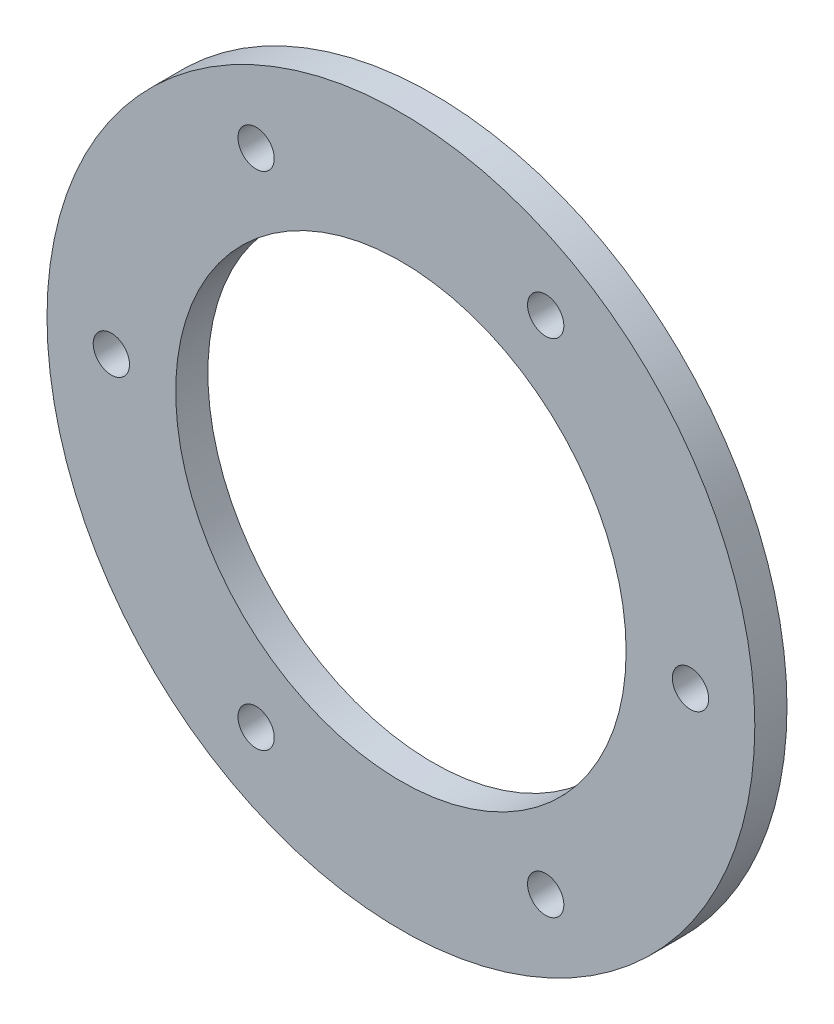
ISO-10303-21;
HEADER;
FILE_DESCRIPTION(('STEP AP214'),'2;1');
FILE_NAME('part.step','',(''),(''),'','','');
FILE_SCHEMA(('AUTOMOTIVE_DESIGN { 1 0 10303 214 1 1 1 1 }'));
ENDSEC;
DATA;
#1=APPLICATION_CONTEXT('core data for automotive mechanical design processes');
#2=APPLICATION_PROTOCOL_DEFINITION('international standard','automotive_design',2000,#1);
#3=PRODUCT_CONTEXT('',#1,'mechanical');
#4=PRODUCT('Part','Part','',(#3));
#5=PRODUCT_RELATED_PRODUCT_CATEGORY('part','',(#4));
#6=PRODUCT_DEFINITION_FORMATION('','',#4);
#7=PRODUCT_DEFINITION_CONTEXT('part definition',#1,'design');
#8=PRODUCT_DEFINITION('design','',#6,#7);
#9=PRODUCT_DEFINITION_SHAPE('','',#8);
#10=(LENGTH_UNIT() NAMED_UNIT(*) SI_UNIT(.MILLI.,.METRE.));
#11=(NAMED_UNIT(*) PLANE_ANGLE_UNIT() SI_UNIT($,.RADIAN.));
#12=(NAMED_UNIT(*) SI_UNIT($,.STERADIAN.) SOLID_ANGLE_UNIT());
#13=UNCERTAINTY_MEASURE_WITH_UNIT(LENGTH_MEASURE(1.E-05),#10,'distance_accuracy_value','');
#14=(GEOMETRIC_REPRESENTATION_CONTEXT(3) GLOBAL_UNCERTAINTY_ASSIGNED_CONTEXT((#13)) GLOBAL_UNIT_ASSIGNED_CONTEXT((#10,
#11,#12)) REPRESENTATION_CONTEXT('',''));
#15=CARTESIAN_POINT('',(0.,0.,0.));
#16=DIRECTION('',(0.,0.,1.));
#17=DIRECTION('',(1.,0.,0.));
#18=AXIS2_PLACEMENT_3D('',#15,#16,#17);
#19=CARTESIAN_POINT('',(365.374066295216,488.872837660157,3.175));
#20=DIRECTION('',(0.,0.,1.));
#21=DIRECTION('',(1.,0.,0.));
#22=AXIS2_PLACEMENT_3D('',#19,#20,#21);
#23=PLANE('',#22);
#24=CARTESIAN_POINT('',(365.374066295216,488.872837660157,3.175));
#25=DIRECTION('',(0.,0.,1.));
#26=DIRECTION('',(1.,0.,0.));
#27=AXIS2_PLACEMENT_3D('',#24,#25,#26);
#28=CIRCLE('',#27,22.225);
#29=CARTESIAN_POINT('',(387.599066295216,488.872837660157,3.175));
#30=VERTEX_POINT('',#29);
#31=EDGE_CURVE('E47',#30,#30,#28,.F.);
#32=ORIENTED_EDGE('',*,*,#31,.T.);
#33=EDGE_LOOP('',(#32));
#34=FACE_BOUND('',#33,.T.);
#35=CARTESIAN_POINT('',(336.799066295216,488.872837660157,3.17500000000001));
#36=DIRECTION('',(0.,0.,-1.));
#37=DIRECTION('',(-1.,0.,0.));
#38=AXIS2_PLACEMENT_3D('',#35,#36,#37);
#39=CIRCLE('',#38,1.7907);
#40=CARTESIAN_POINT('',(335.008366295216,488.872837660157,3.17500000000001));
#41=VERTEX_POINT('',#40);
#42=EDGE_CURVE('E50',#41,#41,#39,.T.);
#43=ORIENTED_EDGE('',*,*,#42,.T.);
#44=EDGE_LOOP('',(#43));
#45=FACE_BOUND('',#44,.T.);
#46=CARTESIAN_POINT('',(351.086566295216,464.126161747017,3.17500000000001));
#47=DIRECTION('',(0.,0.,-1.));
#48=DIRECTION('',(-1.,0.,0.));
#49=AXIS2_PLACEMENT_3D('',#46,#47,#48);
#50=CIRCLE('',#49,1.7907);
#51=CARTESIAN_POINT('',(349.295866295216,464.126161747017,3.17500000000001));
#52=VERTEX_POINT('',#51);
#53=EDGE_CURVE('E53',#52,#52,#50,.T.);
#54=ORIENTED_EDGE('',*,*,#53,.T.);
#55=EDGE_LOOP('',(#54));
#56=FACE_BOUND('',#55,.T.);
#57=CARTESIAN_POINT('',(379.661566295216,464.126161747017,3.17500000000001));
#58=DIRECTION('',(0.,0.,-1.));
#59=DIRECTION('',(-1.,0.,0.));
#60=AXIS2_PLACEMENT_3D('',#57,#58,#59);
#61=CIRCLE('',#60,1.7907);
#62=CARTESIAN_POINT('',(377.870866295216,464.126161747017,3.17500000000001));
#63=VERTEX_POINT('',#62);
#64=EDGE_CURVE('E56',#63,#63,#61,.T.);
#65=ORIENTED_EDGE('',*,*,#64,.T.);
#66=EDGE_LOOP('',(#65));
#67=FACE_BOUND('',#66,.T.);
#68=CARTESIAN_POINT('',(393.949066295216,488.872837660157,3.17500000000001));
#69=DIRECTION('',(0.,0.,-1.));
#70=DIRECTION('',(-1.,0.,0.));
#71=AXIS2_PLACEMENT_3D('',#68,#69,#70);
#72=CIRCLE('',#71,1.7907);
#73=CARTESIAN_POINT('',(392.158366295216,488.872837660157,3.17500000000001));
#74=VERTEX_POINT('',#73);
#75=EDGE_CURVE('E59',#74,#74,#72,.T.);
#76=ORIENTED_EDGE('',*,*,#75,.T.);
#77=EDGE_LOOP('',(#76));
#78=FACE_BOUND('',#77,.T.);
#79=CARTESIAN_POINT('',(379.661566295216,513.619513573297,3.17500000000001));
#80=DIRECTION('',(0.,0.,-1.));
#81=DIRECTION('',(-1.,0.,0.));
#82=AXIS2_PLACEMENT_3D('',#79,#80,#81);
#83=CIRCLE('',#82,1.7907);
#84=CARTESIAN_POINT('',(377.870866295216,513.619513573297,3.17500000000001));
#85=VERTEX_POINT('',#84);
#86=EDGE_CURVE('E62',#85,#85,#83,.T.);
#87=ORIENTED_EDGE('',*,*,#86,.T.);
#88=EDGE_LOOP('',(#87));
#89=FACE_BOUND('',#88,.T.);
#90=CARTESIAN_POINT('',(351.086566295216,513.619513573297,3.17500000000001));
#91=DIRECTION('',(0.,0.,-1.));
#92=DIRECTION('',(-1.,0.,0.));
#93=AXIS2_PLACEMENT_3D('',#90,#91,#92);
#94=CIRCLE('',#93,1.7907);
#95=CARTESIAN_POINT('',(349.295866295216,513.619513573297,3.17500000000001));
#96=VERTEX_POINT('',#95);
#97=EDGE_CURVE('E64',#96,#96,#94,.T.);
#98=ORIENTED_EDGE('',*,*,#97,.T.);
#99=EDGE_LOOP('',(#98));
#100=FACE_BOUND('',#99,.T.);
#101=CARTESIAN_POINT('',(365.374066295216,488.872837660157,3.175));
#102=DIRECTION('',(0.,0.,1.));
#103=DIRECTION('',(1.,0.,0.));
#104=AXIS2_PLACEMENT_3D('',#101,#102,#103);
#105=CIRCLE('',#104,34.925);
#106=CARTESIAN_POINT('',(400.299066295216,488.872837660157,3.175));
#107=VERTEX_POINT('',#106);
#108=EDGE_CURVE('E18',#107,#107,#105,.F.);
#109=ORIENTED_EDGE('',*,*,#108,.F.);
#110=EDGE_LOOP('',(#109));
#111=FACE_BOUND('',#110,.T.);
#112=ADVANCED_FACE('F15',(#34,#45,#56,#67,#78,#89,#100,#111),#23,.T.);
#113=CARTESIAN_POINT('',(365.374066295216,488.872837660157,0.));
#114=DIRECTION('',(0.,0.,1.));
#115=DIRECTION('',(1.,0.,0.));
#116=AXIS2_PLACEMENT_3D('',#113,#114,#115);
#117=CYLINDRICAL_SURFACE('',#116,34.925);
#118=CARTESIAN_POINT('',(365.374066295216,488.872837660157,0.));
#119=DIRECTION('',(0.,0.,1.));
#120=DIRECTION('',(1.,0.,0.));
#121=AXIS2_PLACEMENT_3D('',#118,#119,#120);
#122=CIRCLE('',#121,34.925);
#123=CARTESIAN_POINT('',(400.299066295216,488.872837660157,0.));
#124=VERTEX_POINT('',#123);
#125=EDGE_CURVE('E44',#124,#124,#122,.T.);
#126=ORIENTED_EDGE('',*,*,#125,.T.);
#127=EDGE_LOOP('',(#126));
#128=FACE_BOUND('',#127,.T.);
#129=ORIENTED_EDGE('',*,*,#108,.T.);
#130=EDGE_LOOP('',(#129));
#131=FACE_BOUND('',#130,.T.);
#132=ADVANCED_FACE('F71',(#128,#131),#117,.T.);
#133=CARTESIAN_POINT('',(351.086566295216,513.619513573297,-95.658828343336));
#134=DIRECTION('',(0.,0.,-1.));
#135=DIRECTION('',(-1.,0.,0.));
#136=AXIS2_PLACEMENT_3D('',#133,#134,#135);
#137=CYLINDRICAL_SURFACE('',#136,1.7907);
#138=CARTESIAN_POINT('',(351.086566295216,513.619513573297,0.));
#139=DIRECTION('',(0.,0.,-1.));
#140=DIRECTION('',(-1.,0.,0.));
#141=AXIS2_PLACEMENT_3D('',#138,#139,#140);
#142=CIRCLE('',#141,1.7907);
#143=CARTESIAN_POINT('',(349.295866295216,513.619513573297,0.));
#144=VERTEX_POINT('',#143);
#145=EDGE_CURVE('E41',#144,#144,#142,.T.);
#146=ORIENTED_EDGE('',*,*,#145,.T.);
#147=EDGE_LOOP('',(#146));
#148=FACE_BOUND('',#147,.T.);
#149=ORIENTED_EDGE('',*,*,#97,.F.);
#150=EDGE_LOOP('',(#149));
#151=FACE_BOUND('',#150,.T.);
#152=ADVANCED_FACE('F79',(#148,#151),#137,.F.);
#153=CARTESIAN_POINT('',(379.661566295216,513.619513573297,-95.658828343336));
#154=DIRECTION('',(0.,0.,-1.));
#155=DIRECTION('',(-1.,0.,0.));
#156=AXIS2_PLACEMENT_3D('',#153,#154,#155);
#157=CYLINDRICAL_SURFACE('',#156,1.7907);
#158=CARTESIAN_POINT('',(379.661566295216,513.619513573297,0.));
#159=DIRECTION('',(0.,0.,-1.));
#160=DIRECTION('',(-1.,0.,0.));
#161=AXIS2_PLACEMENT_3D('',#158,#159,#160);
#162=CIRCLE('',#161,1.7907);
#163=CARTESIAN_POINT('',(377.870866295216,513.619513573297,0.));
#164=VERTEX_POINT('',#163);
#165=EDGE_CURVE('E38',#164,#164,#162,.T.);
#166=ORIENTED_EDGE('',*,*,#165,.T.);
#167=EDGE_LOOP('',(#166));
#168=FACE_BOUND('',#167,.T.);
#169=ORIENTED_EDGE('',*,*,#86,.F.);
#170=EDGE_LOOP('',(#169));
#171=FACE_BOUND('',#170,.T.);
#172=ADVANCED_FACE('F108',(#168,#171),#157,.F.);
#173=CARTESIAN_POINT('',(393.949066295216,488.872837660157,-95.658828343336));
#174=DIRECTION('',(0.,0.,-1.));
#175=DIRECTION('',(-1.,0.,0.));
#176=AXIS2_PLACEMENT_3D('',#173,#174,#175);
#177=CYLINDRICAL_SURFACE('',#176,1.7907);
#178=CARTESIAN_POINT('',(393.949066295216,488.872837660157,0.));
#179=DIRECTION('',(0.,0.,-1.));
#180=DIRECTION('',(-1.,0.,0.));
#181=AXIS2_PLACEMENT_3D('',#178,#179,#180);
#182=CIRCLE('',#181,1.7907);
#183=CARTESIAN_POINT('',(392.158366295216,488.872837660157,0.));
#184=VERTEX_POINT('',#183);
#185=EDGE_CURVE('E35',#184,#184,#182,.T.);
#186=ORIENTED_EDGE('',*,*,#185,.T.);
#187=EDGE_LOOP('',(#186));
#188=FACE_BOUND('',#187,.T.);
#189=ORIENTED_EDGE('',*,*,#75,.F.);
#190=EDGE_LOOP('',(#189));
#191=FACE_BOUND('',#190,.T.);
#192=ADVANCED_FACE('F104',(#188,#191),#177,.F.);
#193=CARTESIAN_POINT('',(379.661566295216,464.126161747017,-95.658828343336));
#194=DIRECTION('',(0.,0.,-1.));
#195=DIRECTION('',(-1.,0.,0.));
#196=AXIS2_PLACEMENT_3D('',#193,#194,#195);
#197=CYLINDRICAL_SURFACE('',#196,1.7907);
#198=CARTESIAN_POINT('',(379.661566295216,464.126161747017,0.));
#199=DIRECTION('',(0.,0.,-1.));
#200=DIRECTION('',(-1.,0.,0.));
#201=AXIS2_PLACEMENT_3D('',#198,#199,#200);
#202=CIRCLE('',#201,1.7907);
#203=CARTESIAN_POINT('',(377.870866295216,464.126161747017,0.));
#204=VERTEX_POINT('',#203);
#205=EDGE_CURVE('E32',#204,#204,#202,.T.);
#206=ORIENTED_EDGE('',*,*,#205,.T.);
#207=EDGE_LOOP('',(#206));
#208=FACE_BOUND('',#207,.T.);
#209=ORIENTED_EDGE('',*,*,#64,.F.);
#210=EDGE_LOOP('',(#209));
#211=FACE_BOUND('',#210,.T.);
#212=ADVANCED_FACE('F100',(#208,#211),#197,.F.);
#213=CARTESIAN_POINT('',(351.086566295216,464.126161747017,-95.658828343336));
#214=DIRECTION('',(0.,0.,-1.));
#215=DIRECTION('',(-1.,0.,0.));
#216=AXIS2_PLACEMENT_3D('',#213,#214,#215);
#217=CYLINDRICAL_SURFACE('',#216,1.7907);
#218=CARTESIAN_POINT('',(351.086566295216,464.126161747017,0.));
#219=DIRECTION('',(0.,0.,-1.));
#220=DIRECTION('',(-1.,0.,0.));
#221=AXIS2_PLACEMENT_3D('',#218,#219,#220);
#222=CIRCLE('',#221,1.7907);
#223=CARTESIAN_POINT('',(349.295866295216,464.126161747017,0.));
#224=VERTEX_POINT('',#223);
#225=EDGE_CURVE('E27',#224,#224,#222,.T.);
#226=ORIENTED_EDGE('',*,*,#225,.T.);
#227=EDGE_LOOP('',(#226));
#228=FACE_BOUND('',#227,.T.);
#229=ORIENTED_EDGE('',*,*,#53,.F.);
#230=EDGE_LOOP('',(#229));
#231=FACE_BOUND('',#230,.T.);
#232=ADVANCED_FACE('F96',(#228,#231),#217,.F.);
#233=CARTESIAN_POINT('',(336.799066295216,488.872837660157,-95.658828343336));
#234=DIRECTION('',(0.,0.,-1.));
#235=DIRECTION('',(-1.,0.,0.));
#236=AXIS2_PLACEMENT_3D('',#233,#234,#235);
#237=CYLINDRICAL_SURFACE('',#236,1.7907);
#238=CARTESIAN_POINT('',(336.799066295216,488.872837660157,0.));
#239=DIRECTION('',(0.,0.,-1.));
#240=DIRECTION('',(-1.,0.,0.));
#241=AXIS2_PLACEMENT_3D('',#238,#239,#240);
#242=CIRCLE('',#241,1.7907);
#243=CARTESIAN_POINT('',(335.008366295216,488.872837660157,0.));
#244=VERTEX_POINT('',#243);
#245=EDGE_CURVE('E22',#244,#244,#242,.T.);
#246=ORIENTED_EDGE('',*,*,#245,.T.);
#247=EDGE_LOOP('',(#246));
#248=FACE_BOUND('',#247,.T.);
#249=ORIENTED_EDGE('',*,*,#42,.F.);
#250=EDGE_LOOP('',(#249));
#251=FACE_BOUND('',#250,.T.);
#252=ADVANCED_FACE('F90',(#248,#251),#237,.F.);
#253=CARTESIAN_POINT('',(365.374066295216,488.872837660157,0.));
#254=DIRECTION('',(0.,0.,1.));
#255=DIRECTION('',(1.,0.,0.));
#256=AXIS2_PLACEMENT_3D('',#253,#254,#255);
#257=CYLINDRICAL_SURFACE('',#256,22.225);
#258=CARTESIAN_POINT('',(365.374066295216,488.872837660157,0.));
#259=DIRECTION('',(0.,0.,1.));
#260=DIRECTION('',(1.,0.,0.));
#261=AXIS2_PLACEMENT_3D('',#258,#259,#260);
#262=CIRCLE('',#261,22.225);
#263=CARTESIAN_POINT('',(387.599066295216,488.872837660157,0.));
#264=VERTEX_POINT('',#263);
#265=EDGE_CURVE('E10',#264,#264,#262,.F.);
#266=ORIENTED_EDGE('',*,*,#265,.T.);
#267=EDGE_LOOP('',(#266));
#268=FACE_BOUND('',#267,.T.);
#269=ORIENTED_EDGE('',*,*,#31,.F.);
#270=EDGE_LOOP('',(#269));
#271=FACE_BOUND('',#270,.T.);
#272=ADVANCED_FACE('F84',(#268,#271),#257,.F.);
#273=CARTESIAN_POINT('',(365.374066295216,488.872837660157,0.));
#274=DIRECTION('',(0.,0.,1.));
#275=DIRECTION('',(1.,0.,0.));
#276=AXIS2_PLACEMENT_3D('',#273,#274,#275);
#277=PLANE('',#276);
#278=ORIENTED_EDGE('',*,*,#265,.F.);
#279=EDGE_LOOP('',(#278));
#280=FACE_BOUND('',#279,.T.);
#281=ORIENTED_EDGE('',*,*,#245,.F.);
#282=EDGE_LOOP('',(#281));
#283=FACE_BOUND('',#282,.T.);
#284=ORIENTED_EDGE('',*,*,#225,.F.);
#285=EDGE_LOOP('',(#284));
#286=FACE_BOUND('',#285,.T.);
#287=ORIENTED_EDGE('',*,*,#205,.F.);
#288=EDGE_LOOP('',(#287));
#289=FACE_BOUND('',#288,.T.);
#290=ORIENTED_EDGE('',*,*,#185,.F.);
#291=EDGE_LOOP('',(#290));
#292=FACE_BOUND('',#291,.T.);
#293=ORIENTED_EDGE('',*,*,#165,.F.);
#294=EDGE_LOOP('',(#293));
#295=FACE_BOUND('',#294,.T.);
#296=ORIENTED_EDGE('',*,*,#145,.F.);
#297=EDGE_LOOP('',(#296));
#298=FACE_BOUND('',#297,.T.);
#299=ORIENTED_EDGE('',*,*,#125,.F.);
#300=EDGE_LOOP('',(#299));
#301=FACE_BOUND('',#300,.T.);
#302=ADVANCED_FACE('F82',(#280,#283,#286,#289,#292,#295,#298,#301),#277,.F.);
#303=CLOSED_SHELL('',(#112,#132,#152,#172,#192,#212,#232,#252,#272,#302));
#304=MANIFOLD_SOLID_BREP('B1',#303);
#305=ADVANCED_BREP_SHAPE_REPRESENTATION('',(#18,#304),#14);
#306=SHAPE_DEFINITION_REPRESENTATION(#9,#305);
ENDSEC;
END-ISO-10303-21;
